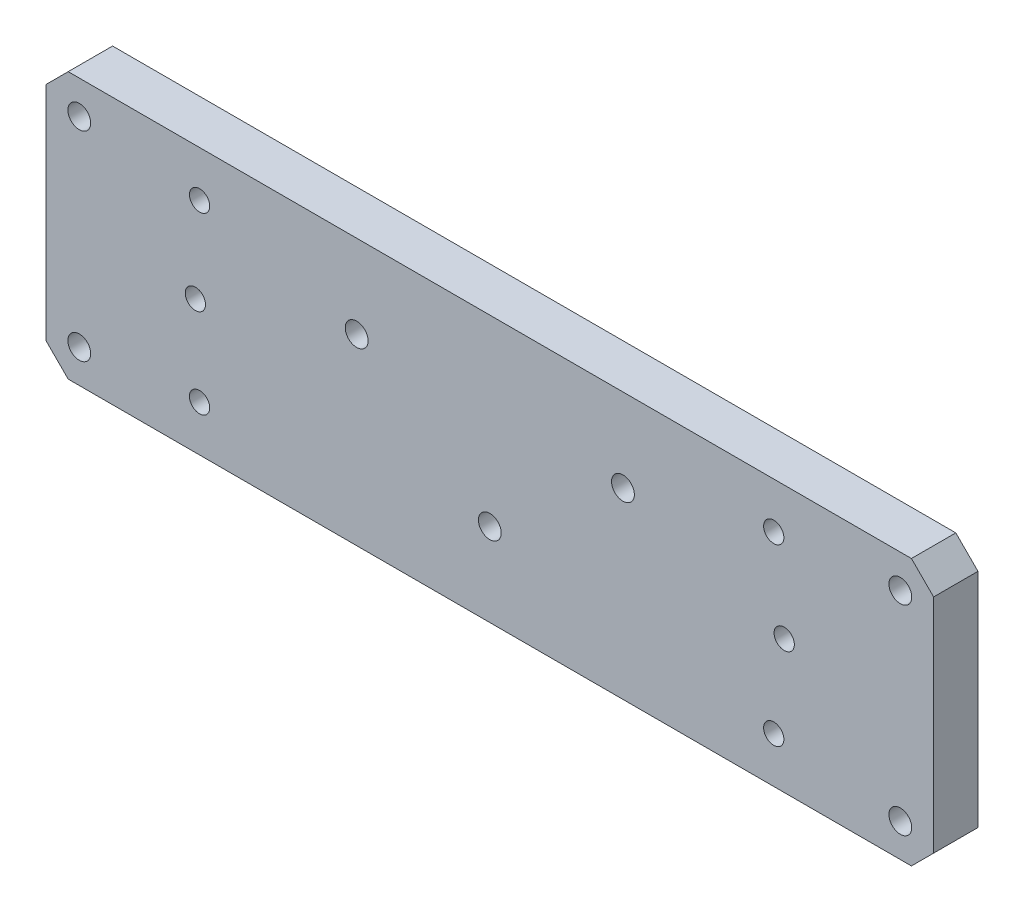
ISO-10303-21;
HEADER;
FILE_DESCRIPTION(('STEP AP214'),'2;1');
FILE_NAME('part.step','',(''),(''),'','','');
FILE_SCHEMA(('AUTOMOTIVE_DESIGN { 1 0 10303 214 1 1 1 1 }'));
ENDSEC;
DATA;
#1=APPLICATION_CONTEXT('core data for automotive mechanical design processes');
#2=APPLICATION_PROTOCOL_DEFINITION('international standard','automotive_design',2000,#1);
#3=PRODUCT_CONTEXT('',#1,'mechanical');
#4=PRODUCT('Part','Part','',(#3));
#5=PRODUCT_RELATED_PRODUCT_CATEGORY('part','',(#4));
#6=PRODUCT_DEFINITION_FORMATION('','',#4);
#7=PRODUCT_DEFINITION_CONTEXT('part definition',#1,'design');
#8=PRODUCT_DEFINITION('design','',#6,#7);
#9=PRODUCT_DEFINITION_SHAPE('','',#8);
#10=(LENGTH_UNIT() NAMED_UNIT(*) SI_UNIT(.MILLI.,.METRE.));
#11=(NAMED_UNIT(*) PLANE_ANGLE_UNIT() SI_UNIT($,.RADIAN.));
#12=(NAMED_UNIT(*) SI_UNIT($,.STERADIAN.) SOLID_ANGLE_UNIT());
#13=UNCERTAINTY_MEASURE_WITH_UNIT(LENGTH_MEASURE(1.E-05),#10,'distance_accuracy_value','');
#14=(GEOMETRIC_REPRESENTATION_CONTEXT(3) GLOBAL_UNCERTAINTY_ASSIGNED_CONTEXT((#13)) GLOBAL_UNIT_ASSIGNED_CONTEXT((#10,
#11,#12)) REPRESENTATION_CONTEXT('',''));
#15=CARTESIAN_POINT('',(0.,0.,0.));
#16=DIRECTION('',(0.,0.,1.));
#17=DIRECTION('',(1.,0.,0.));
#18=AXIS2_PLACEMENT_3D('',#15,#16,#17);
#19=CARTESIAN_POINT('',(-127.,-38.1,12.7));
#20=DIRECTION('',(1.,0.,0.));
#21=DIRECTION('',(0.,0.,-1.));
#22=AXIS2_PLACEMENT_3D('',#19,#20,#21);
#23=PLANE('',#22);
#24=DIRECTION('',(0.,-1.,0.));
#25=VECTOR('',#24,1.);
#26=CARTESIAN_POINT('',(-127.,-38.1,12.7));
#27=LINE('',#26,#25);
#28=CARTESIAN_POINT('',(-127.,31.75,12.7));
#29=VERTEX_POINT('',#28);
#30=CARTESIAN_POINT('',(-127.,-31.75,12.7));
#31=VERTEX_POINT('',#30);
#32=EDGE_CURVE('E131',#29,#31,#27,.T.);
#33=ORIENTED_EDGE('',*,*,#32,.F.);
#34=DIRECTION('',(0.,0.,-1.));
#35=VECTOR('',#34,1.);
#36=CARTESIAN_POINT('',(-127.,31.75,12.7));
#37=LINE('',#36,#35);
#38=CARTESIAN_POINT('',(-127.,31.75,0.));
#39=VERTEX_POINT('',#38);
#40=EDGE_CURVE('E11',#29,#39,#37,.T.);
#41=ORIENTED_EDGE('',*,*,#40,.T.);
#42=DIRECTION('',(0.,-1.,0.));
#43=VECTOR('',#42,1.);
#44=CARTESIAN_POINT('',(-127.,-38.1,0.));
#45=LINE('',#44,#43);
#46=CARTESIAN_POINT('',(-127.,-31.75,0.));
#47=VERTEX_POINT('',#46);
#48=EDGE_CURVE('E162',#39,#47,#45,.T.);
#49=ORIENTED_EDGE('',*,*,#48,.T.);
#50=DIRECTION('',(0.,0.,1.));
#51=VECTOR('',#50,1.);
#52=CARTESIAN_POINT('',(-127.,-31.75,12.7));
#53=LINE('',#52,#51);
#54=EDGE_CURVE('E45',#47,#31,#53,.T.);
#55=ORIENTED_EDGE('',*,*,#54,.T.);
#56=EDGE_LOOP('',(#33,#41,#49,#55));
#57=FACE_BOUND('',#56,.T.);
#58=ADVANCED_FACE('F36',(#57),#23,.F.);
#59=CARTESIAN_POINT('',(127.,-38.1,12.7));
#60=DIRECTION('',(0.,1.,0.));
#61=DIRECTION('',(-1.,0.,0.));
#62=AXIS2_PLACEMENT_3D('',#59,#60,#61);
#63=PLANE('',#62);
#64=DIRECTION('',(1.,0.,0.));
#65=VECTOR('',#64,1.);
#66=CARTESIAN_POINT('',(127.,-38.1,0.));
#67=LINE('',#66,#65);
#68=CARTESIAN_POINT('',(-120.65,-38.1,0.));
#69=VERTEX_POINT('',#68);
#70=CARTESIAN_POINT('',(120.65,-38.1,0.));
#71=VERTEX_POINT('',#70);
#72=EDGE_CURVE('E136',#69,#71,#67,.T.);
#73=ORIENTED_EDGE('',*,*,#72,.T.);
#74=DIRECTION('',(0.,0.,1.));
#75=VECTOR('',#74,1.);
#76=CARTESIAN_POINT('',(120.65,-38.1,12.7));
#77=LINE('',#76,#75);
#78=CARTESIAN_POINT('',(120.65,-38.1,12.7));
#79=VERTEX_POINT('',#78);
#80=EDGE_CURVE('E52',#71,#79,#77,.T.);
#81=ORIENTED_EDGE('',*,*,#80,.T.);
#82=DIRECTION('',(1.,0.,0.));
#83=VECTOR('',#82,1.);
#84=CARTESIAN_POINT('',(127.,-38.1,12.7));
#85=LINE('',#84,#83);
#86=CARTESIAN_POINT('',(-120.65,-38.1,12.7));
#87=VERTEX_POINT('',#86);
#88=EDGE_CURVE('E134',#87,#79,#85,.T.);
#89=ORIENTED_EDGE('',*,*,#88,.F.);
#90=DIRECTION('',(0.,0.,-1.));
#91=VECTOR('',#90,1.);
#92=CARTESIAN_POINT('',(-120.65,-38.1,12.7));
#93=LINE('',#92,#91);
#94=EDGE_CURVE('E154',#87,#69,#93,.T.);
#95=ORIENTED_EDGE('',*,*,#94,.T.);
#96=EDGE_LOOP('',(#73,#81,#89,#95));
#97=FACE_BOUND('',#96,.T.);
#98=ADVANCED_FACE('F169',(#97),#63,.F.);
#99=CARTESIAN_POINT('',(127.,-38.1,12.7));
#100=DIRECTION('',(-1.,0.,0.));
#101=DIRECTION('',(0.,0.,1.));
#102=AXIS2_PLACEMENT_3D('',#99,#100,#101);
#103=PLANE('',#102);
#104=DIRECTION('',(0.,1.,0.));
#105=VECTOR('',#104,1.);
#106=CARTESIAN_POINT('',(127.,-38.1,0.));
#107=LINE('',#106,#105);
#108=CARTESIAN_POINT('',(127.,-31.75,0.));
#109=VERTEX_POINT('',#108);
#110=CARTESIAN_POINT('',(127.,31.75,0.));
#111=VERTEX_POINT('',#110);
#112=EDGE_CURVE('E132',#109,#111,#107,.T.);
#113=ORIENTED_EDGE('',*,*,#112,.T.);
#114=DIRECTION('',(0.,0.,1.));
#115=VECTOR('',#114,1.);
#116=CARTESIAN_POINT('',(127.,31.75,12.7));
#117=LINE('',#116,#115);
#118=CARTESIAN_POINT('',(127.,31.75,12.7));
#119=VERTEX_POINT('',#118);
#120=EDGE_CURVE('E109',#111,#119,#117,.T.);
#121=ORIENTED_EDGE('',*,*,#120,.T.);
#122=DIRECTION('',(0.,1.,0.));
#123=VECTOR('',#122,1.);
#124=CARTESIAN_POINT('',(127.,-38.1,12.7));
#125=LINE('',#124,#123);
#126=CARTESIAN_POINT('',(127.,-31.75,12.7));
#127=VERTEX_POINT('',#126);
#128=EDGE_CURVE('E174',#127,#119,#125,.T.);
#129=ORIENTED_EDGE('',*,*,#128,.F.);
#130=DIRECTION('',(0.,0.,-1.));
#131=VECTOR('',#130,1.);
#132=CARTESIAN_POINT('',(127.,-31.75,12.7));
#133=LINE('',#132,#131);
#134=EDGE_CURVE('E114',#127,#109,#133,.T.);
#135=ORIENTED_EDGE('',*,*,#134,.T.);
#136=EDGE_LOOP('',(#113,#121,#129,#135));
#137=FACE_BOUND('',#136,.T.);
#138=ADVANCED_FACE('F316',(#137),#103,.F.);
#139=CARTESIAN_POINT('',(127.,38.1,12.7));
#140=DIRECTION('',(0.,-1.,0.));
#141=DIRECTION('',(1.,0.,0.));
#142=AXIS2_PLACEMENT_3D('',#139,#140,#141);
#143=PLANE('',#142);
#144=DIRECTION('',(-1.,0.,0.));
#145=VECTOR('',#144,1.);
#146=CARTESIAN_POINT('',(127.,38.1,12.7));
#147=LINE('',#146,#145);
#148=CARTESIAN_POINT('',(120.65,38.1,12.7));
#149=VERTEX_POINT('',#148);
#150=CARTESIAN_POINT('',(-120.65,38.1,12.7));
#151=VERTEX_POINT('',#150);
#152=EDGE_CURVE('E124',#149,#151,#147,.T.);
#153=ORIENTED_EDGE('',*,*,#152,.F.);
#154=DIRECTION('',(0.,0.,-1.));
#155=VECTOR('',#154,1.);
#156=CARTESIAN_POINT('',(120.65,38.1,12.7));
#157=LINE('',#156,#155);
#158=CARTESIAN_POINT('',(120.65,38.1,0.));
#159=VERTEX_POINT('',#158);
#160=EDGE_CURVE('E108',#149,#159,#157,.T.);
#161=ORIENTED_EDGE('',*,*,#160,.T.);
#162=DIRECTION('',(-1.,0.,0.));
#163=VECTOR('',#162,1.);
#164=CARTESIAN_POINT('',(127.,38.1,0.));
#165=LINE('',#164,#163);
#166=CARTESIAN_POINT('',(-120.65,38.1,0.));
#167=VERTEX_POINT('',#166);
#168=EDGE_CURVE('E121',#159,#167,#165,.T.);
#169=ORIENTED_EDGE('',*,*,#168,.T.);
#170=DIRECTION('',(0.,0.,1.));
#171=VECTOR('',#170,1.);
#172=CARTESIAN_POINT('',(-120.65,38.1,12.7));
#173=LINE('',#172,#171);
#174=EDGE_CURVE('E126',#167,#151,#173,.T.);
#175=ORIENTED_EDGE('',*,*,#174,.T.);
#176=EDGE_LOOP('',(#153,#161,#169,#175));
#177=FACE_BOUND('',#176,.T.);
#178=ADVANCED_FACE('F120',(#177),#143,.F.);
#179=CARTESIAN_POINT('',(0.,0.,12.7));
#180=DIRECTION('',(0.,0.,1.));
#181=DIRECTION('',(1.,0.,0.));
#182=AXIS2_PLACEMENT_3D('',#179,#180,#181);
#183=PLANE('',#182);
#184=CARTESIAN_POINT('',(81.25,-25.,12.7));
#185=DIRECTION('',(0.,0.,-1.));
#186=DIRECTION('',(-1.,0.,0.));
#187=AXIS2_PLACEMENT_3D('',#184,#185,#186);
#188=CIRCLE('',#187,2.89999999999999);
#189=CARTESIAN_POINT('',(78.35,-25.,12.7));
#190=VERTEX_POINT('',#189);
#191=EDGE_CURVE('E263',#190,#190,#188,.T.);
#192=ORIENTED_EDGE('',*,*,#191,.T.);
#193=EDGE_LOOP('',(#192));
#194=FACE_BOUND('',#193,.T.);
#195=CARTESIAN_POINT('',(81.25,25.,12.7));
#196=DIRECTION('',(0.,0.,-1.));
#197=DIRECTION('',(-1.,0.,0.));
#198=AXIS2_PLACEMENT_3D('',#195,#196,#197);
#199=CIRCLE('',#198,2.89999999999999);
#200=CARTESIAN_POINT('',(78.35,25.,12.7));
#201=VERTEX_POINT('',#200);
#202=EDGE_CURVE('E254',#201,#201,#199,.T.);
#203=ORIENTED_EDGE('',*,*,#202,.T.);
#204=EDGE_LOOP('',(#203));
#205=FACE_BOUND('',#204,.T.);
#206=CARTESIAN_POINT('',(-83.05,25.,12.7));
#207=DIRECTION('',(0.,0.,-1.));
#208=DIRECTION('',(-1.,0.,0.));
#209=AXIS2_PLACEMENT_3D('',#206,#207,#208);
#210=CIRCLE('',#209,2.89999999999999);
#211=CARTESIAN_POINT('',(-85.95,25.,12.7));
#212=VERTEX_POINT('',#211);
#213=EDGE_CURVE('E245',#212,#212,#210,.T.);
#214=ORIENTED_EDGE('',*,*,#213,.T.);
#215=EDGE_LOOP('',(#214));
#216=FACE_BOUND('',#215,.T.);
#217=CARTESIAN_POINT('',(-83.05,-25.,12.7));
#218=DIRECTION('',(0.,0.,-1.));
#219=DIRECTION('',(-1.,0.,0.));
#220=AXIS2_PLACEMENT_3D('',#217,#218,#219);
#221=CIRCLE('',#220,2.89999999999999);
#222=CARTESIAN_POINT('',(-85.95,-25.,12.7));
#223=VERTEX_POINT('',#222);
#224=EDGE_CURVE('E236',#223,#223,#221,.T.);
#225=ORIENTED_EDGE('',*,*,#224,.T.);
#226=EDGE_LOOP('',(#225));
#227=FACE_BOUND('',#226,.T.);
#228=CARTESIAN_POINT('',(84.25,0.,12.7));
#229=DIRECTION('',(0.,0.,-1.));
#230=DIRECTION('',(-1.,0.,0.));
#231=AXIS2_PLACEMENT_3D('',#228,#229,#230);
#232=CIRCLE('',#231,2.89999999999999);
#233=CARTESIAN_POINT('',(81.35,0.,12.7));
#234=VERTEX_POINT('',#233);
#235=EDGE_CURVE('E227',#234,#234,#232,.T.);
#236=ORIENTED_EDGE('',*,*,#235,.T.);
#237=EDGE_LOOP('',(#236));
#238=FACE_BOUND('',#237,.T.);
#239=CARTESIAN_POINT('',(-84.25,0.,12.7));
#240=DIRECTION('',(0.,0.,-1.));
#241=DIRECTION('',(-1.,0.,0.));
#242=AXIS2_PLACEMENT_3D('',#239,#240,#241);
#243=CIRCLE('',#242,2.89999999999999);
#244=CARTESIAN_POINT('',(-87.15,0.,12.7));
#245=VERTEX_POINT('',#244);
#246=EDGE_CURVE('E218',#245,#245,#243,.T.);
#247=ORIENTED_EDGE('',*,*,#246,.T.);
#248=EDGE_LOOP('',(#247));
#249=FACE_BOUND('',#248,.T.);
#250=CARTESIAN_POINT('',(-117.475,-28.575,12.7));
#251=DIRECTION('',(0.,0.,1.));
#252=DIRECTION('',(1.,0.,0.));
#253=AXIS2_PLACEMENT_3D('',#250,#251,#252);
#254=CIRCLE('',#253,3.26389999999999);
#255=CARTESIAN_POINT('',(-114.2111,-28.575,12.7));
#256=VERTEX_POINT('',#255);
#257=EDGE_CURVE('E215',#256,#256,#254,.T.);
#258=ORIENTED_EDGE('',*,*,#257,.F.);
#259=EDGE_LOOP('',(#258));
#260=FACE_BOUND('',#259,.T.);
#261=CARTESIAN_POINT('',(-117.475,28.575,12.7));
#262=DIRECTION('',(0.,0.,1.));
#263=DIRECTION('',(1.,0.,0.));
#264=AXIS2_PLACEMENT_3D('',#261,#262,#263);
#265=CIRCLE('',#264,3.26389999999999);
#266=CARTESIAN_POINT('',(-114.2111,28.575,12.7));
#267=VERTEX_POINT('',#266);
#268=EDGE_CURVE('E209',#267,#267,#265,.T.);
#269=ORIENTED_EDGE('',*,*,#268,.F.);
#270=EDGE_LOOP('',(#269));
#271=FACE_BOUND('',#270,.T.);
#272=CARTESIAN_POINT('',(117.475,-28.575,12.7));
#273=DIRECTION('',(0.,0.,1.));
#274=DIRECTION('',(1.,0.,0.));
#275=AXIS2_PLACEMENT_3D('',#272,#273,#274);
#276=CIRCLE('',#275,3.26389999999999);
#277=CARTESIAN_POINT('',(120.7389,-28.575,12.7));
#278=VERTEX_POINT('',#277);
#279=EDGE_CURVE('E203',#278,#278,#276,.T.);
#280=ORIENTED_EDGE('',*,*,#279,.F.);
#281=EDGE_LOOP('',(#280));
#282=FACE_BOUND('',#281,.T.);
#283=CARTESIAN_POINT('',(117.475,28.575,12.7));
#284=DIRECTION('',(0.,0.,1.));
#285=DIRECTION('',(1.,0.,0.));
#286=AXIS2_PLACEMENT_3D('',#283,#284,#285);
#287=CIRCLE('',#286,3.26389999999999);
#288=CARTESIAN_POINT('',(120.7389,28.575,12.7));
#289=VERTEX_POINT('',#288);
#290=EDGE_CURVE('E197',#289,#289,#287,.T.);
#291=ORIENTED_EDGE('',*,*,#290,.F.);
#292=EDGE_LOOP('',(#291));
#293=FACE_BOUND('',#292,.T.);
#294=CARTESIAN_POINT('',(-38.1,14.2875,12.7));
#295=DIRECTION('',(0.,0.,1.));
#296=DIRECTION('',(1.,0.,0.));
#297=AXIS2_PLACEMENT_3D('',#294,#295,#296);
#298=CIRCLE('',#297,3.26389999999999);
#299=CARTESIAN_POINT('',(-34.8361,14.2875,12.7));
#300=VERTEX_POINT('',#299);
#301=EDGE_CURVE('E191',#300,#300,#298,.T.);
#302=ORIENTED_EDGE('',*,*,#301,.F.);
#303=EDGE_LOOP('',(#302));
#304=FACE_BOUND('',#303,.T.);
#305=CARTESIAN_POINT('',(0.,-14.2875,12.7));
#306=DIRECTION('',(0.,0.,1.));
#307=DIRECTION('',(1.,0.,0.));
#308=AXIS2_PLACEMENT_3D('',#305,#306,#307);
#309=CIRCLE('',#308,3.26389999999999);
#310=CARTESIAN_POINT('',(3.26389999999999,-14.2875,12.7));
#311=VERTEX_POINT('',#310);
#312=EDGE_CURVE('E185',#311,#311,#309,.T.);
#313=ORIENTED_EDGE('',*,*,#312,.F.);
#314=EDGE_LOOP('',(#313));
#315=FACE_BOUND('',#314,.T.);
#316=CARTESIAN_POINT('',(38.1,14.2875,12.7));
#317=DIRECTION('',(0.,0.,1.));
#318=DIRECTION('',(1.,0.,0.));
#319=AXIS2_PLACEMENT_3D('',#316,#317,#318);
#320=CIRCLE('',#319,3.26389999999999);
#321=CARTESIAN_POINT('',(41.3639,14.2875,12.7));
#322=VERTEX_POINT('',#321);
#323=EDGE_CURVE('E179',#322,#322,#320,.T.);
#324=ORIENTED_EDGE('',*,*,#323,.F.);
#325=EDGE_LOOP('',(#324));
#326=FACE_BOUND('',#325,.T.);
#327=ORIENTED_EDGE('',*,*,#128,.T.);
#328=DIRECTION('',(0.707106781186544,-0.707106781186551,0.));
#329=VECTOR('',#328,1.);
#330=CARTESIAN_POINT('',(79.3750000000005,79.3749999999999,12.7));
#331=LINE('',#330,#329);
#332=EDGE_CURVE('E152',#119,#149,#331,.F.);
#333=ORIENTED_EDGE('',*,*,#332,.T.);
#334=ORIENTED_EDGE('',*,*,#152,.T.);
#335=DIRECTION('',(0.707106781186549,0.707106781186546,0.));
#336=VECTOR('',#335,1.);
#337=CARTESIAN_POINT('',(-79.3749999999997,79.3750000000001,12.7));
#338=LINE('',#337,#336);
#339=EDGE_CURVE('E148',#151,#29,#338,.F.);
#340=ORIENTED_EDGE('',*,*,#339,.T.);
#341=ORIENTED_EDGE('',*,*,#32,.T.);
#342=DIRECTION('',(-0.707106781186544,0.707106781186551,0.));
#343=VECTOR('',#342,1.);
#344=CARTESIAN_POINT('',(-79.3750000000006,-79.3749999999999,12.7));
#345=LINE('',#344,#343);
#346=EDGE_CURVE('E59',#31,#87,#345,.F.);
#347=ORIENTED_EDGE('',*,*,#346,.T.);
#348=ORIENTED_EDGE('',*,*,#88,.T.);
#349=DIRECTION('',(-0.707106781186549,-0.707106781186546,0.));
#350=VECTOR('',#349,1.);
#351=CARTESIAN_POINT('',(79.3749999999997,-79.3750000000001,12.7));
#352=LINE('',#351,#350);
#353=EDGE_CURVE('E150',#79,#127,#352,.F.);
#354=ORIENTED_EDGE('',*,*,#353,.T.);
#355=EDGE_LOOP('',(#327,#333,#334,#340,#341,#347,#348,#354));
#356=FACE_BOUND('',#355,.T.);
#357=ADVANCED_FACE('F165',(#194,#205,#216,#227,#238,#249,#260,#271,#282,#293,#304,#315,#326,
#356),#183,.T.);
#358=CARTESIAN_POINT('',(0.,0.,0.));
#359=DIRECTION('',(0.,0.,1.));
#360=DIRECTION('',(1.,0.,0.));
#361=AXIS2_PLACEMENT_3D('',#358,#359,#360);
#362=PLANE('',#361);
#363=CARTESIAN_POINT('',(81.25,-25.,0.));
#364=DIRECTION('',(0.,0.,-1.));
#365=DIRECTION('',(-1.,0.,0.));
#366=AXIS2_PLACEMENT_3D('',#363,#364,#365);
#367=CIRCLE('',#366,5.2);
#368=CARTESIAN_POINT('',(76.05,-25.,0.));
#369=VERTEX_POINT('',#368);
#370=EDGE_CURVE('E269',#369,#369,#367,.T.);
#371=ORIENTED_EDGE('',*,*,#370,.F.);
#372=EDGE_LOOP('',(#371));
#373=FACE_BOUND('',#372,.T.);
#374=CARTESIAN_POINT('',(81.25,25.,0.));
#375=DIRECTION('',(0.,0.,-1.));
#376=DIRECTION('',(-1.,0.,0.));
#377=AXIS2_PLACEMENT_3D('',#374,#375,#376);
#378=CIRCLE('',#377,5.2);
#379=CARTESIAN_POINT('',(76.05,25.,0.));
#380=VERTEX_POINT('',#379);
#381=EDGE_CURVE('E260',#380,#380,#378,.T.);
#382=ORIENTED_EDGE('',*,*,#381,.F.);
#383=EDGE_LOOP('',(#382));
#384=FACE_BOUND('',#383,.T.);
#385=CARTESIAN_POINT('',(-83.05,25.,0.));
#386=DIRECTION('',(0.,0.,-1.));
#387=DIRECTION('',(-1.,0.,0.));
#388=AXIS2_PLACEMENT_3D('',#385,#386,#387);
#389=CIRCLE('',#388,5.2);
#390=CARTESIAN_POINT('',(-88.25,25.,0.));
#391=VERTEX_POINT('',#390);
#392=EDGE_CURVE('E251',#391,#391,#389,.T.);
#393=ORIENTED_EDGE('',*,*,#392,.F.);
#394=EDGE_LOOP('',(#393));
#395=FACE_BOUND('',#394,.T.);
#396=CARTESIAN_POINT('',(-83.05,-25.,0.));
#397=DIRECTION('',(0.,0.,-1.));
#398=DIRECTION('',(-1.,0.,0.));
#399=AXIS2_PLACEMENT_3D('',#396,#397,#398);
#400=CIRCLE('',#399,5.2);
#401=CARTESIAN_POINT('',(-88.25,-25.,0.));
#402=VERTEX_POINT('',#401);
#403=EDGE_CURVE('E242',#402,#402,#400,.T.);
#404=ORIENTED_EDGE('',*,*,#403,.F.);
#405=EDGE_LOOP('',(#404));
#406=FACE_BOUND('',#405,.T.);
#407=CARTESIAN_POINT('',(84.25,0.,0.));
#408=DIRECTION('',(0.,0.,-1.));
#409=DIRECTION('',(-1.,0.,0.));
#410=AXIS2_PLACEMENT_3D('',#407,#408,#409);
#411=CIRCLE('',#410,5.2);
#412=CARTESIAN_POINT('',(79.05,0.,0.));
#413=VERTEX_POINT('',#412);
#414=EDGE_CURVE('E233',#413,#413,#411,.T.);
#415=ORIENTED_EDGE('',*,*,#414,.F.);
#416=EDGE_LOOP('',(#415));
#417=FACE_BOUND('',#416,.T.);
#418=CARTESIAN_POINT('',(-84.25,0.,0.));
#419=DIRECTION('',(0.,0.,-1.));
#420=DIRECTION('',(-1.,0.,0.));
#421=AXIS2_PLACEMENT_3D('',#418,#419,#420);
#422=CIRCLE('',#421,5.2);
#423=CARTESIAN_POINT('',(-89.45,0.,0.));
#424=VERTEX_POINT('',#423);
#425=EDGE_CURVE('E224',#424,#424,#422,.T.);
#426=ORIENTED_EDGE('',*,*,#425,.F.);
#427=EDGE_LOOP('',(#426));
#428=FACE_BOUND('',#427,.T.);
#429=CARTESIAN_POINT('',(-117.475,-28.575,0.));
#430=DIRECTION('',(0.,0.,1.));
#431=DIRECTION('',(1.,0.,0.));
#432=AXIS2_PLACEMENT_3D('',#429,#430,#431);
#433=CIRCLE('',#432,3.2639);
#434=CARTESIAN_POINT('',(-114.2111,-28.575,0.));
#435=VERTEX_POINT('',#434);
#436=EDGE_CURVE('E212',#435,#435,#433,.T.);
#437=ORIENTED_EDGE('',*,*,#436,.T.);
#438=EDGE_LOOP('',(#437));
#439=FACE_BOUND('',#438,.T.);
#440=CARTESIAN_POINT('',(-117.475,28.575,0.));
#441=DIRECTION('',(0.,0.,1.));
#442=DIRECTION('',(1.,0.,0.));
#443=AXIS2_PLACEMENT_3D('',#440,#441,#442);
#444=CIRCLE('',#443,3.2639);
#445=CARTESIAN_POINT('',(-114.2111,28.575,0.));
#446=VERTEX_POINT('',#445);
#447=EDGE_CURVE('E206',#446,#446,#444,.T.);
#448=ORIENTED_EDGE('',*,*,#447,.T.);
#449=EDGE_LOOP('',(#448));
#450=FACE_BOUND('',#449,.T.);
#451=CARTESIAN_POINT('',(117.475,-28.575,0.));
#452=DIRECTION('',(0.,0.,1.));
#453=DIRECTION('',(1.,0.,0.));
#454=AXIS2_PLACEMENT_3D('',#451,#452,#453);
#455=CIRCLE('',#454,3.2639);
#456=CARTESIAN_POINT('',(120.7389,-28.575,0.));
#457=VERTEX_POINT('',#456);
#458=EDGE_CURVE('E200',#457,#457,#455,.T.);
#459=ORIENTED_EDGE('',*,*,#458,.T.);
#460=EDGE_LOOP('',(#459));
#461=FACE_BOUND('',#460,.T.);
#462=CARTESIAN_POINT('',(117.475,28.575,0.));
#463=DIRECTION('',(0.,0.,1.));
#464=DIRECTION('',(1.,0.,0.));
#465=AXIS2_PLACEMENT_3D('',#462,#463,#464);
#466=CIRCLE('',#465,3.2639);
#467=CARTESIAN_POINT('',(120.7389,28.575,0.));
#468=VERTEX_POINT('',#467);
#469=EDGE_CURVE('E194',#468,#468,#466,.T.);
#470=ORIENTED_EDGE('',*,*,#469,.T.);
#471=EDGE_LOOP('',(#470));
#472=FACE_BOUND('',#471,.T.);
#473=CARTESIAN_POINT('',(-38.1,14.2875,0.));
#474=DIRECTION('',(0.,0.,1.));
#475=DIRECTION('',(1.,0.,0.));
#476=AXIS2_PLACEMENT_3D('',#473,#474,#475);
#477=CIRCLE('',#476,3.2639);
#478=CARTESIAN_POINT('',(-34.8361,14.2875,0.));
#479=VERTEX_POINT('',#478);
#480=EDGE_CURVE('E188',#479,#479,#477,.T.);
#481=ORIENTED_EDGE('',*,*,#480,.T.);
#482=EDGE_LOOP('',(#481));
#483=FACE_BOUND('',#482,.T.);
#484=CARTESIAN_POINT('',(0.,-14.2875,0.));
#485=DIRECTION('',(0.,0.,1.));
#486=DIRECTION('',(1.,0.,0.));
#487=AXIS2_PLACEMENT_3D('',#484,#485,#486);
#488=CIRCLE('',#487,3.2639);
#489=CARTESIAN_POINT('',(3.2639,-14.2875,0.));
#490=VERTEX_POINT('',#489);
#491=EDGE_CURVE('E182',#490,#490,#488,.T.);
#492=ORIENTED_EDGE('',*,*,#491,.T.);
#493=EDGE_LOOP('',(#492));
#494=FACE_BOUND('',#493,.T.);
#495=CARTESIAN_POINT('',(38.1,14.2875,0.));
#496=DIRECTION('',(0.,0.,1.));
#497=DIRECTION('',(1.,0.,0.));
#498=AXIS2_PLACEMENT_3D('',#495,#496,#497);
#499=CIRCLE('',#498,3.2639);
#500=CARTESIAN_POINT('',(41.3639,14.2875,0.));
#501=VERTEX_POINT('',#500);
#502=EDGE_CURVE('E170',#501,#501,#499,.T.);
#503=ORIENTED_EDGE('',*,*,#502,.T.);
#504=EDGE_LOOP('',(#503));
#505=FACE_BOUND('',#504,.T.);
#506=ORIENTED_EDGE('',*,*,#168,.F.);
#507=DIRECTION('',(-0.707106781186544,0.707106781186551,0.));
#508=VECTOR('',#507,1.);
#509=CARTESIAN_POINT('',(120.65,38.1,0.));
#510=LINE('',#509,#508);
#511=EDGE_CURVE('E104',#159,#111,#510,.F.);
#512=ORIENTED_EDGE('',*,*,#511,.T.);
#513=ORIENTED_EDGE('',*,*,#112,.F.);
#514=DIRECTION('',(0.707106781186549,0.707106781186546,0.));
#515=VECTOR('',#514,1.);
#516=CARTESIAN_POINT('',(127.,-31.75,0.));
#517=LINE('',#516,#515);
#518=EDGE_CURVE('E115',#109,#71,#517,.F.);
#519=ORIENTED_EDGE('',*,*,#518,.T.);
#520=ORIENTED_EDGE('',*,*,#72,.F.);
#521=DIRECTION('',(0.707106781186544,-0.707106781186551,0.));
#522=VECTOR('',#521,1.);
#523=CARTESIAN_POINT('',(-120.65,-38.1,0.));
#524=LINE('',#523,#522);
#525=EDGE_CURVE('E125',#69,#47,#524,.F.);
#526=ORIENTED_EDGE('',*,*,#525,.T.);
#527=ORIENTED_EDGE('',*,*,#48,.F.);
#528=DIRECTION('',(-0.707106781186549,-0.707106781186546,0.));
#529=VECTOR('',#528,1.);
#530=CARTESIAN_POINT('',(-127.,31.75,0.));
#531=LINE('',#530,#529);
#532=EDGE_CURVE('E130',#39,#167,#531,.F.);
#533=ORIENTED_EDGE('',*,*,#532,.T.);
#534=EDGE_LOOP('',(#506,#512,#513,#519,#520,#526,#527,#533));
#535=FACE_BOUND('',#534,.T.);
#536=ADVANCED_FACE('F128',(#373,#384,#395,#406,#417,#428,#439,#450,#461,#472,#483,#494,#505,
#535),#362,.F.);
#537=CARTESIAN_POINT('',(38.1,14.2875,12.7));
#538=DIRECTION('',(0.,0.,1.));
#539=DIRECTION('',(1.,0.,0.));
#540=AXIS2_PLACEMENT_3D('',#537,#538,#539);
#541=CYLINDRICAL_SURFACE('',#540,3.26389999999999);
#542=ORIENTED_EDGE('',*,*,#502,.F.);
#543=EDGE_LOOP('',(#542));
#544=FACE_BOUND('',#543,.T.);
#545=ORIENTED_EDGE('',*,*,#323,.T.);
#546=EDGE_LOOP('',(#545));
#547=FACE_BOUND('',#546,.T.);
#548=ADVANCED_FACE('F277',(#544,#547),#541,.F.);
#549=CARTESIAN_POINT('',(0.,-14.2875,12.7));
#550=DIRECTION('',(0.,0.,1.));
#551=DIRECTION('',(1.,0.,0.));
#552=AXIS2_PLACEMENT_3D('',#549,#550,#551);
#553=CYLINDRICAL_SURFACE('',#552,3.26389999999999);
#554=ORIENTED_EDGE('',*,*,#491,.F.);
#555=EDGE_LOOP('',(#554));
#556=FACE_BOUND('',#555,.T.);
#557=ORIENTED_EDGE('',*,*,#312,.T.);
#558=EDGE_LOOP('',(#557));
#559=FACE_BOUND('',#558,.T.);
#560=ADVANCED_FACE('F305',(#556,#559),#553,.F.);
#561=CARTESIAN_POINT('',(-38.1,14.2875,12.7));
#562=DIRECTION('',(0.,0.,1.));
#563=DIRECTION('',(1.,0.,0.));
#564=AXIS2_PLACEMENT_3D('',#561,#562,#563);
#565=CYLINDRICAL_SURFACE('',#564,3.26389999999999);
#566=ORIENTED_EDGE('',*,*,#480,.F.);
#567=EDGE_LOOP('',(#566));
#568=FACE_BOUND('',#567,.T.);
#569=ORIENTED_EDGE('',*,*,#301,.T.);
#570=EDGE_LOOP('',(#569));
#571=FACE_BOUND('',#570,.T.);
#572=ADVANCED_FACE('F521',(#568,#571),#565,.F.);
#573=CARTESIAN_POINT('',(117.475,28.575,12.7));
#574=DIRECTION('',(0.,0.,1.));
#575=DIRECTION('',(1.,0.,0.));
#576=AXIS2_PLACEMENT_3D('',#573,#574,#575);
#577=CYLINDRICAL_SURFACE('',#576,3.26389999999999);
#578=ORIENTED_EDGE('',*,*,#469,.F.);
#579=EDGE_LOOP('',(#578));
#580=FACE_BOUND('',#579,.T.);
#581=ORIENTED_EDGE('',*,*,#290,.T.);
#582=EDGE_LOOP('',(#581));
#583=FACE_BOUND('',#582,.T.);
#584=ADVANCED_FACE('F517',(#580,#583),#577,.F.);
#585=CARTESIAN_POINT('',(117.475,-28.575,12.7));
#586=DIRECTION('',(0.,0.,1.));
#587=DIRECTION('',(1.,0.,0.));
#588=AXIS2_PLACEMENT_3D('',#585,#586,#587);
#589=CYLINDRICAL_SURFACE('',#588,3.26389999999999);
#590=ORIENTED_EDGE('',*,*,#458,.F.);
#591=EDGE_LOOP('',(#590));
#592=FACE_BOUND('',#591,.T.);
#593=ORIENTED_EDGE('',*,*,#279,.T.);
#594=EDGE_LOOP('',(#593));
#595=FACE_BOUND('',#594,.T.);
#596=ADVANCED_FACE('F513',(#592,#595),#589,.F.);
#597=CARTESIAN_POINT('',(-117.475,28.575,12.7));
#598=DIRECTION('',(0.,0.,1.));
#599=DIRECTION('',(1.,0.,0.));
#600=AXIS2_PLACEMENT_3D('',#597,#598,#599);
#601=CYLINDRICAL_SURFACE('',#600,3.26389999999999);
#602=ORIENTED_EDGE('',*,*,#447,.F.);
#603=EDGE_LOOP('',(#602));
#604=FACE_BOUND('',#603,.T.);
#605=ORIENTED_EDGE('',*,*,#268,.T.);
#606=EDGE_LOOP('',(#605));
#607=FACE_BOUND('',#606,.T.);
#608=ADVANCED_FACE('F509',(#604,#607),#601,.F.);
#609=CARTESIAN_POINT('',(-117.475,-28.575,12.7));
#610=DIRECTION('',(0.,0.,1.));
#611=DIRECTION('',(1.,0.,0.));
#612=AXIS2_PLACEMENT_3D('',#609,#610,#611);
#613=CYLINDRICAL_SURFACE('',#612,3.26389999999999);
#614=ORIENTED_EDGE('',*,*,#436,.F.);
#615=EDGE_LOOP('',(#614));
#616=FACE_BOUND('',#615,.T.);
#617=ORIENTED_EDGE('',*,*,#257,.T.);
#618=EDGE_LOOP('',(#617));
#619=FACE_BOUND('',#618,.T.);
#620=ADVANCED_FACE('F335',(#616,#619),#613,.F.);
#621=CARTESIAN_POINT('',(120.65,38.1,12.7));
#622=DIRECTION('',(-0.707106781186551,-0.707106781186544,0.));
#623=DIRECTION('',(0.,0.,-1.));
#624=AXIS2_PLACEMENT_3D('',#621,#622,#623);
#625=PLANE('',#624);
#626=ORIENTED_EDGE('',*,*,#332,.F.);
#627=ORIENTED_EDGE('',*,*,#120,.F.);
#628=ORIENTED_EDGE('',*,*,#511,.F.);
#629=ORIENTED_EDGE('',*,*,#160,.F.);
#630=EDGE_LOOP('',(#626,#627,#628,#629));
#631=FACE_BOUND('',#630,.T.);
#632=ADVANCED_FACE('F107',(#631),#625,.F.);
#633=CARTESIAN_POINT('',(127.,-31.75,12.7));
#634=DIRECTION('',(-0.707106781186546,0.707106781186549,0.));
#635=DIRECTION('',(0.,0.,-1.));
#636=AXIS2_PLACEMENT_3D('',#633,#634,#635);
#637=PLANE('',#636);
#638=ORIENTED_EDGE('',*,*,#353,.F.);
#639=ORIENTED_EDGE('',*,*,#80,.F.);
#640=ORIENTED_EDGE('',*,*,#518,.F.);
#641=ORIENTED_EDGE('',*,*,#134,.F.);
#642=EDGE_LOOP('',(#638,#639,#640,#641));
#643=FACE_BOUND('',#642,.T.);
#644=ADVANCED_FACE('F334',(#643),#637,.F.);
#645=CARTESIAN_POINT('',(-127.,31.75,12.7));
#646=DIRECTION('',(0.707106781186546,-0.707106781186549,0.));
#647=DIRECTION('',(0.,0.,-1.));
#648=AXIS2_PLACEMENT_3D('',#645,#646,#647);
#649=PLANE('',#648);
#650=ORIENTED_EDGE('',*,*,#339,.F.);
#651=ORIENTED_EDGE('',*,*,#174,.F.);
#652=ORIENTED_EDGE('',*,*,#532,.F.);
#653=ORIENTED_EDGE('',*,*,#40,.F.);
#654=EDGE_LOOP('',(#650,#651,#652,#653));
#655=FACE_BOUND('',#654,.T.);
#656=ADVANCED_FACE('F340',(#655),#649,.F.);
#657=CARTESIAN_POINT('',(-120.65,-38.1,12.7));
#658=DIRECTION('',(0.707106781186551,0.707106781186544,0.));
#659=DIRECTION('',(0.,0.,-1.));
#660=AXIS2_PLACEMENT_3D('',#657,#658,#659);
#661=PLANE('',#660);
#662=ORIENTED_EDGE('',*,*,#346,.F.);
#663=ORIENTED_EDGE('',*,*,#54,.F.);
#664=ORIENTED_EDGE('',*,*,#525,.F.);
#665=ORIENTED_EDGE('',*,*,#94,.F.);
#666=EDGE_LOOP('',(#662,#663,#664,#665));
#667=FACE_BOUND('',#666,.T.);
#668=ADVANCED_FACE('F39',(#667),#661,.F.);
#669=CARTESIAN_POINT('',(-84.25,0.,0.));
#670=DIRECTION('',(0.,0.,-1.));
#671=DIRECTION('',(-1.,0.,0.));
#672=AXIS2_PLACEMENT_3D('',#669,#670,#671);
#673=CYLINDRICAL_SURFACE('',#672,2.89999999999999);
#674=ORIENTED_EDGE('',*,*,#246,.F.);
#675=EDGE_LOOP('',(#674));
#676=FACE_BOUND('',#675,.T.);
#677=CARTESIAN_POINT('',(-84.25,0.,2.30000000000001));
#678=DIRECTION('',(0.,0.,-1.));
#679=DIRECTION('',(-1.,0.,0.));
#680=AXIS2_PLACEMENT_3D('',#677,#678,#679);
#681=CIRCLE('',#680,2.89999999999999);
#682=CARTESIAN_POINT('',(-87.15,0.,2.30000000000001));
#683=VERTEX_POINT('',#682);
#684=EDGE_CURVE('E221',#683,#683,#681,.T.);
#685=ORIENTED_EDGE('',*,*,#684,.T.);
#686=EDGE_LOOP('',(#685));
#687=FACE_BOUND('',#686,.T.);
#688=ADVANCED_FACE('F349',(#676,#687),#673,.F.);
#689=CARTESIAN_POINT('',(-84.25,0.,0.));
#690=DIRECTION('',(0.,0.,-1.));
#691=DIRECTION('',(-1.,0.,0.));
#692=AXIS2_PLACEMENT_3D('',#689,#690,#691);
#693=CONICAL_SURFACE('',#692,5.2,0.785398163397448);
#694=ORIENTED_EDGE('',*,*,#684,.F.);
#695=EDGE_LOOP('',(#694));
#696=FACE_BOUND('',#695,.T.);
#697=ORIENTED_EDGE('',*,*,#425,.T.);
#698=EDGE_LOOP('',(#697));
#699=FACE_BOUND('',#698,.T.);
#700=ADVANCED_FACE('F393',(#696,#699),#693,.F.);
#701=CARTESIAN_POINT('',(84.25,0.,0.));
#702=DIRECTION('',(0.,0.,-1.));
#703=DIRECTION('',(-1.,0.,0.));
#704=AXIS2_PLACEMENT_3D('',#701,#702,#703);
#705=CYLINDRICAL_SURFACE('',#704,2.89999999999999);
#706=ORIENTED_EDGE('',*,*,#235,.F.);
#707=EDGE_LOOP('',(#706));
#708=FACE_BOUND('',#707,.T.);
#709=CARTESIAN_POINT('',(84.25,0.,2.30000000000001));
#710=DIRECTION('',(0.,0.,-1.));
#711=DIRECTION('',(-1.,0.,0.));
#712=AXIS2_PLACEMENT_3D('',#709,#710,#711);
#713=CIRCLE('',#712,2.89999999999999);
#714=CARTESIAN_POINT('',(81.35,0.,2.30000000000001));
#715=VERTEX_POINT('',#714);
#716=EDGE_CURVE('E230',#715,#715,#713,.T.);
#717=ORIENTED_EDGE('',*,*,#716,.T.);
#718=EDGE_LOOP('',(#717));
#719=FACE_BOUND('',#718,.T.);
#720=ADVANCED_FACE('F400',(#708,#719),#705,.F.);
#721=CARTESIAN_POINT('',(84.25,0.,0.));
#722=DIRECTION('',(0.,0.,-1.));
#723=DIRECTION('',(-1.,0.,0.));
#724=AXIS2_PLACEMENT_3D('',#721,#722,#723);
#725=CONICAL_SURFACE('',#724,5.2,0.785398163397448);
#726=ORIENTED_EDGE('',*,*,#716,.F.);
#727=EDGE_LOOP('',(#726));
#728=FACE_BOUND('',#727,.T.);
#729=ORIENTED_EDGE('',*,*,#414,.T.);
#730=EDGE_LOOP('',(#729));
#731=FACE_BOUND('',#730,.T.);
#732=ADVANCED_FACE('F408',(#728,#731),#725,.F.);
#733=CARTESIAN_POINT('',(-83.05,-25.,0.));
#734=DIRECTION('',(0.,0.,-1.));
#735=DIRECTION('',(-1.,0.,0.));
#736=AXIS2_PLACEMENT_3D('',#733,#734,#735);
#737=CYLINDRICAL_SURFACE('',#736,2.89999999999999);
#738=ORIENTED_EDGE('',*,*,#224,.F.);
#739=EDGE_LOOP('',(#738));
#740=FACE_BOUND('',#739,.T.);
#741=CARTESIAN_POINT('',(-83.05,-25.,2.30000000000001));
#742=DIRECTION('',(0.,0.,-1.));
#743=DIRECTION('',(-1.,0.,0.));
#744=AXIS2_PLACEMENT_3D('',#741,#742,#743);
#745=CIRCLE('',#744,2.89999999999999);
#746=CARTESIAN_POINT('',(-85.95,-25.,2.30000000000001));
#747=VERTEX_POINT('',#746);
#748=EDGE_CURVE('E239',#747,#747,#745,.T.);
#749=ORIENTED_EDGE('',*,*,#748,.T.);
#750=EDGE_LOOP('',(#749));
#751=FACE_BOUND('',#750,.T.);
#752=ADVANCED_FACE('F416',(#740,#751),#737,.F.);
#753=CARTESIAN_POINT('',(-83.05,-25.,0.));
#754=DIRECTION('',(0.,0.,-1.));
#755=DIRECTION('',(-1.,0.,0.));
#756=AXIS2_PLACEMENT_3D('',#753,#754,#755);
#757=CONICAL_SURFACE('',#756,5.2,0.785398163397448);
#758=ORIENTED_EDGE('',*,*,#748,.F.);
#759=EDGE_LOOP('',(#758));
#760=FACE_BOUND('',#759,.T.);
#761=ORIENTED_EDGE('',*,*,#403,.T.);
#762=EDGE_LOOP('',(#761));
#763=FACE_BOUND('',#762,.T.);
#764=ADVANCED_FACE('F424',(#760,#763),#757,.F.);
#765=CARTESIAN_POINT('',(-83.05,25.,0.));
#766=DIRECTION('',(0.,0.,-1.));
#767=DIRECTION('',(-1.,0.,0.));
#768=AXIS2_PLACEMENT_3D('',#765,#766,#767);
#769=CYLINDRICAL_SURFACE('',#768,2.89999999999999);
#770=ORIENTED_EDGE('',*,*,#213,.F.);
#771=EDGE_LOOP('',(#770));
#772=FACE_BOUND('',#771,.T.);
#773=CARTESIAN_POINT('',(-83.05,25.,2.30000000000001));
#774=DIRECTION('',(0.,0.,-1.));
#775=DIRECTION('',(-1.,0.,0.));
#776=AXIS2_PLACEMENT_3D('',#773,#774,#775);
#777=CIRCLE('',#776,2.89999999999999);
#778=CARTESIAN_POINT('',(-85.95,25.,2.30000000000001));
#779=VERTEX_POINT('',#778);
#780=EDGE_CURVE('E248',#779,#779,#777,.T.);
#781=ORIENTED_EDGE('',*,*,#780,.T.);
#782=EDGE_LOOP('',(#781));
#783=FACE_BOUND('',#782,.T.);
#784=ADVANCED_FACE('F432',(#772,#783),#769,.F.);
#785=CARTESIAN_POINT('',(-83.05,25.,0.));
#786=DIRECTION('',(0.,0.,-1.));
#787=DIRECTION('',(-1.,0.,0.));
#788=AXIS2_PLACEMENT_3D('',#785,#786,#787);
#789=CONICAL_SURFACE('',#788,5.2,0.785398163397448);
#790=ORIENTED_EDGE('',*,*,#780,.F.);
#791=EDGE_LOOP('',(#790));
#792=FACE_BOUND('',#791,.T.);
#793=ORIENTED_EDGE('',*,*,#392,.T.);
#794=EDGE_LOOP('',(#793));
#795=FACE_BOUND('',#794,.T.);
#796=ADVANCED_FACE('F440',(#792,#795),#789,.F.);
#797=CARTESIAN_POINT('',(81.25,25.,0.));
#798=DIRECTION('',(0.,0.,-1.));
#799=DIRECTION('',(-1.,0.,0.));
#800=AXIS2_PLACEMENT_3D('',#797,#798,#799);
#801=CYLINDRICAL_SURFACE('',#800,2.89999999999999);
#802=ORIENTED_EDGE('',*,*,#202,.F.);
#803=EDGE_LOOP('',(#802));
#804=FACE_BOUND('',#803,.T.);
#805=CARTESIAN_POINT('',(81.25,25.,2.30000000000001));
#806=DIRECTION('',(0.,0.,-1.));
#807=DIRECTION('',(-1.,0.,0.));
#808=AXIS2_PLACEMENT_3D('',#805,#806,#807);
#809=CIRCLE('',#808,2.89999999999999);
#810=CARTESIAN_POINT('',(78.35,25.,2.30000000000001));
#811=VERTEX_POINT('',#810);
#812=EDGE_CURVE('E257',#811,#811,#809,.T.);
#813=ORIENTED_EDGE('',*,*,#812,.T.);
#814=EDGE_LOOP('',(#813));
#815=FACE_BOUND('',#814,.T.);
#816=ADVANCED_FACE('F448',(#804,#815),#801,.F.);
#817=CARTESIAN_POINT('',(81.25,25.,0.));
#818=DIRECTION('',(0.,0.,-1.));
#819=DIRECTION('',(-1.,0.,0.));
#820=AXIS2_PLACEMENT_3D('',#817,#818,#819);
#821=CONICAL_SURFACE('',#820,5.2,0.785398163397448);
#822=ORIENTED_EDGE('',*,*,#812,.F.);
#823=EDGE_LOOP('',(#822));
#824=FACE_BOUND('',#823,.T.);
#825=ORIENTED_EDGE('',*,*,#381,.T.);
#826=EDGE_LOOP('',(#825));
#827=FACE_BOUND('',#826,.T.);
#828=ADVANCED_FACE('F456',(#824,#827),#821,.F.);
#829=CARTESIAN_POINT('',(81.25,-25.,0.));
#830=DIRECTION('',(0.,0.,-1.));
#831=DIRECTION('',(-1.,0.,0.));
#832=AXIS2_PLACEMENT_3D('',#829,#830,#831);
#833=CYLINDRICAL_SURFACE('',#832,2.89999999999999);
#834=ORIENTED_EDGE('',*,*,#191,.F.);
#835=EDGE_LOOP('',(#834));
#836=FACE_BOUND('',#835,.T.);
#837=CARTESIAN_POINT('',(81.25,-25.,2.30000000000001));
#838=DIRECTION('',(0.,0.,-1.));
#839=DIRECTION('',(-1.,0.,0.));
#840=AXIS2_PLACEMENT_3D('',#837,#838,#839);
#841=CIRCLE('',#840,2.89999999999999);
#842=CARTESIAN_POINT('',(78.35,-25.,2.30000000000001));
#843=VERTEX_POINT('',#842);
#844=EDGE_CURVE('E266',#843,#843,#841,.T.);
#845=ORIENTED_EDGE('',*,*,#844,.T.);
#846=EDGE_LOOP('',(#845));
#847=FACE_BOUND('',#846,.T.);
#848=ADVANCED_FACE('F464',(#836,#847),#833,.F.);
#849=CARTESIAN_POINT('',(81.25,-25.,0.));
#850=DIRECTION('',(0.,0.,-1.));
#851=DIRECTION('',(-1.,0.,0.));
#852=AXIS2_PLACEMENT_3D('',#849,#850,#851);
#853=CONICAL_SURFACE('',#852,5.2,0.785398163397448);
#854=ORIENTED_EDGE('',*,*,#844,.F.);
#855=EDGE_LOOP('',(#854));
#856=FACE_BOUND('',#855,.T.);
#857=ORIENTED_EDGE('',*,*,#370,.T.);
#858=EDGE_LOOP('',(#857));
#859=FACE_BOUND('',#858,.T.);
#860=ADVANCED_FACE('F273',(#856,#859),#853,.F.);
#861=CLOSED_SHELL('',(#58,#98,#138,#178,#357,#536,#548,#560,#572,#584,#596,#608,#620,#632,#644,
#656,#668,#688,#700,#720,#732,#752,#764,#784,#796,#816,#828,#848,#860));
#862=MANIFOLD_SOLID_BREP('B2',#861);
#863=ADVANCED_BREP_SHAPE_REPRESENTATION('',(#18,#862),#14);
#864=SHAPE_DEFINITION_REPRESENTATION(#9,#863);
ENDSEC;
END-ISO-10303-21;
